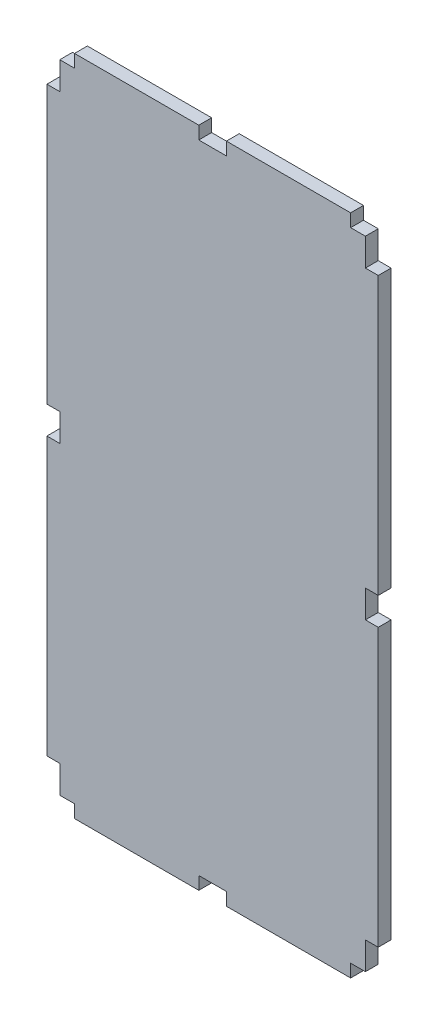
ISO-10303-21;
HEADER;
FILE_DESCRIPTION(('STEP AP214'),'2;1');
FILE_NAME('part.step','',(''),(''),'','','');
FILE_SCHEMA(('AUTOMOTIVE_DESIGN { 1 0 10303 214 1 1 1 1 }'));
ENDSEC;
DATA;
#1=APPLICATION_CONTEXT('core data for automotive mechanical design processes');
#2=APPLICATION_PROTOCOL_DEFINITION('international standard','automotive_design',2000,#1);
#3=PRODUCT_CONTEXT('',#1,'mechanical');
#4=PRODUCT('Part','Part','',(#3));
#5=PRODUCT_RELATED_PRODUCT_CATEGORY('part','',(#4));
#6=PRODUCT_DEFINITION_FORMATION('','',#4);
#7=PRODUCT_DEFINITION_CONTEXT('part definition',#1,'design');
#8=PRODUCT_DEFINITION('design','',#6,#7);
#9=PRODUCT_DEFINITION_SHAPE('','',#8);
#10=(LENGTH_UNIT() NAMED_UNIT(*) SI_UNIT(.MILLI.,.METRE.));
#11=(NAMED_UNIT(*) PLANE_ANGLE_UNIT() SI_UNIT($,.RADIAN.));
#12=(NAMED_UNIT(*) SI_UNIT($,.STERADIAN.) SOLID_ANGLE_UNIT());
#13=UNCERTAINTY_MEASURE_WITH_UNIT(LENGTH_MEASURE(1.E-05),#10,'distance_accuracy_value','');
#14=(GEOMETRIC_REPRESENTATION_CONTEXT(3) GLOBAL_UNCERTAINTY_ASSIGNED_CONTEXT((#13)) GLOBAL_UNIT_ASSIGNED_CONTEXT((#10,
#11,#12)) REPRESENTATION_CONTEXT('',''));
#15=CARTESIAN_POINT('',(0.,0.,0.));
#16=DIRECTION('',(0.,0.,1.));
#17=DIRECTION('',(1.,0.,0.));
#18=AXIS2_PLACEMENT_3D('',#15,#16,#17);
#19=CARTESIAN_POINT('',(0.,0.,11.81));
#20=DIRECTION('',(0.,0.,1.));
#21=DIRECTION('',(1.,0.,0.));
#22=AXIS2_PLACEMENT_3D('',#19,#20,#21);
#23=PLANE('',#22);
#24=DIRECTION('',(0.,1.,0.));
#25=VECTOR('',#24,1.);
#26=CARTESIAN_POINT('',(279.400000000005,457.199963665008,11.81));
#27=LINE('',#26,#25);
#28=CARTESIAN_POINT('',(279.400000000005,-115.190036334992,11.81));
#29=VERTEX_POINT('',#28);
#30=CARTESIAN_POINT('',(279.400000000005,139.699963665008,11.81));
#31=VERTEX_POINT('',#30);
#32=EDGE_CURVE('E518',#29,#31,#27,.T.);
#33=ORIENTED_EDGE('',*,*,#32,.T.);
#34=DIRECTION('',(-1.,0.,0.));
#35=VECTOR('',#34,1.);
#36=CARTESIAN_POINT('',(279.400000000005,139.699963665008,11.81));
#37=LINE('',#36,#35);
#38=CARTESIAN_POINT('',(267.590000000005,139.699963665008,11.81));
#39=VERTEX_POINT('',#38);
#40=EDGE_CURVE('E295',#31,#39,#37,.T.);
#41=ORIENTED_EDGE('',*,*,#40,.T.);
#42=DIRECTION('',(0.,1.,0.));
#43=VECTOR('',#42,1.);
#44=CARTESIAN_POINT('',(267.590000000005,139.699963665008,11.81));
#45=LINE('',#44,#43);
#46=CARTESIAN_POINT('',(267.590000000005,165.099963665008,11.81));
#47=VERTEX_POINT('',#46);
#48=EDGE_CURVE('E298',#39,#47,#45,.T.);
#49=ORIENTED_EDGE('',*,*,#48,.T.);
#50=DIRECTION('',(1.,0.,0.));
#51=VECTOR('',#50,1.);
#52=CARTESIAN_POINT('',(279.400000000005,165.099963665008,11.81));
#53=LINE('',#52,#51);
#54=CARTESIAN_POINT('',(279.400000000005,165.099963665008,11.81));
#55=VERTEX_POINT('',#54);
#56=EDGE_CURVE('E286',#47,#55,#53,.T.);
#57=ORIENTED_EDGE('',*,*,#56,.T.);
#58=CARTESIAN_POINT('',(279.400000000005,419.989963665008,11.81));
#59=VERTEX_POINT('',#58);
#60=EDGE_CURVE('E522',#55,#59,#27,.T.);
#61=ORIENTED_EDGE('',*,*,#60,.T.);
#62=DIRECTION('',(-1.,0.,0.));
#63=VECTOR('',#62,1.);
#64=CARTESIAN_POINT('',(279.400000000005,419.989963665008,11.81));
#65=LINE('',#64,#63);
#66=CARTESIAN_POINT('',(267.590000000005,419.989963665008,11.81));
#67=VERTEX_POINT('',#66);
#68=EDGE_CURVE('E313',#59,#67,#65,.T.);
#69=ORIENTED_EDGE('',*,*,#68,.T.);
#70=DIRECTION('',(0.,1.,0.));
#71=VECTOR('',#70,1.);
#72=CARTESIAN_POINT('',(267.590000000005,419.989963665008,11.81));
#73=LINE('',#72,#71);
#74=CARTESIAN_POINT('',(267.590000000005,445.389963665008,11.81));
#75=VERTEX_POINT('',#74);
#76=EDGE_CURVE('E316',#67,#75,#73,.T.);
#77=ORIENTED_EDGE('',*,*,#76,.T.);
#78=DIRECTION('',(-1.,0.,0.));
#79=VECTOR('',#78,1.);
#80=CARTESIAN_POINT('',(254.000000000005,445.389963665008,11.81));
#81=LINE('',#80,#79);
#82=CARTESIAN_POINT('',(254.000000000005,445.389963665008,11.81));
#83=VERTEX_POINT('',#82);
#84=EDGE_CURVE('E436',#75,#83,#81,.T.);
#85=ORIENTED_EDGE('',*,*,#84,.T.);
#86=DIRECTION('',(0.,1.,0.));
#87=VECTOR('',#86,1.);
#88=CARTESIAN_POINT('',(254.000000000005,457.199963665008,11.81));
#89=LINE('',#88,#87);
#90=CARTESIAN_POINT('',(254.000000000005,457.199963665008,11.81));
#91=VERTEX_POINT('',#90);
#92=EDGE_CURVE('E402',#83,#91,#89,.T.);
#93=ORIENTED_EDGE('',*,*,#92,.T.);
#94=DIRECTION('',(-1.,0.,0.));
#95=VECTOR('',#94,1.);
#96=CARTESIAN_POINT('',(-25.3999999999953,457.199963665008,11.81));
#97=LINE('',#96,#95);
#98=CARTESIAN_POINT('',(139.700000000005,457.199963665008,11.81));
#99=VERTEX_POINT('',#98);
#100=EDGE_CURVE('E524',#91,#99,#97,.T.);
#101=ORIENTED_EDGE('',*,*,#100,.T.);
#102=DIRECTION('',(0.,-1.,0.));
#103=VECTOR('',#102,1.);
#104=CARTESIAN_POINT('',(139.700000000005,457.199963665008,11.81));
#105=LINE('',#104,#103);
#106=CARTESIAN_POINT('',(139.700000000005,445.389963665008,11.81));
#107=VERTEX_POINT('',#106);
#108=EDGE_CURVE('E409',#99,#107,#105,.T.);
#109=ORIENTED_EDGE('',*,*,#108,.T.);
#110=DIRECTION('',(-1.,0.,0.));
#111=VECTOR('',#110,1.);
#112=CARTESIAN_POINT('',(114.300000000005,445.389963665008,11.81));
#113=LINE('',#112,#111);
#114=CARTESIAN_POINT('',(114.300000000005,445.389963665008,11.81));
#115=VERTEX_POINT('',#114);
#116=EDGE_CURVE('E418',#107,#115,#113,.T.);
#117=ORIENTED_EDGE('',*,*,#116,.T.);
#118=DIRECTION('',(0.,1.,0.));
#119=VECTOR('',#118,1.);
#120=CARTESIAN_POINT('',(114.300000000005,457.199963665008,11.81));
#121=LINE('',#120,#119);
#122=CARTESIAN_POINT('',(114.300000000005,457.199963665008,11.81));
#123=VERTEX_POINT('',#122);
#124=EDGE_CURVE('E415',#115,#123,#121,.T.);
#125=ORIENTED_EDGE('',*,*,#124,.T.);
#126=CARTESIAN_POINT('',(4.79130624064794E-12,457.199963665008,11.81));
#127=VERTEX_POINT('',#126);
#128=EDGE_CURVE('E521',#123,#127,#97,.T.);
#129=ORIENTED_EDGE('',*,*,#128,.T.);
#130=DIRECTION('',(0.,-1.,0.));
#131=VECTOR('',#130,1.);
#132=CARTESIAN_POINT('',(4.79130624064794E-12,457.199963665008,11.81));
#133=LINE('',#132,#131);
#134=CARTESIAN_POINT('',(4.78913677884325E-12,445.389963665008,11.81));
#135=VERTEX_POINT('',#134);
#136=EDGE_CURVE('E449',#127,#135,#133,.T.);
#137=ORIENTED_EDGE('',*,*,#136,.T.);
#138=DIRECTION('',(-1.,0.,0.));
#139=VECTOR('',#138,1.);
#140=CARTESIAN_POINT('',(-25.3999999999952,445.389963665008,11.81));
#141=LINE('',#140,#139);
#142=CARTESIAN_POINT('',(-13.5899999999952,445.389963665008,11.81));
#143=VERTEX_POINT('',#142);
#144=EDGE_CURVE('E426',#135,#143,#141,.T.);
#145=ORIENTED_EDGE('',*,*,#144,.T.);
#146=DIRECTION('',(0.,1.,0.));
#147=VECTOR('',#146,1.);
#148=CARTESIAN_POINT('',(-13.5899999999952,419.989963665008,11.81));
#149=LINE('',#148,#147);
#150=CARTESIAN_POINT('',(-13.5899999999952,419.989963665008,11.81));
#151=VERTEX_POINT('',#150);
#152=EDGE_CURVE('E375',#151,#143,#149,.T.);
#153=ORIENTED_EDGE('',*,*,#152,.F.);
#154=DIRECTION('',(1.,0.,0.));
#155=VECTOR('',#154,1.);
#156=CARTESIAN_POINT('',(-25.3999999999952,419.989963665008,11.81));
#157=LINE('',#156,#155);
#158=CARTESIAN_POINT('',(-25.3999999999952,419.989963665008,11.81));
#159=VERTEX_POINT('',#158);
#160=EDGE_CURVE('E339',#159,#151,#157,.T.);
#161=ORIENTED_EDGE('',*,*,#160,.F.);
#162=DIRECTION('',(0.,-1.,0.));
#163=VECTOR('',#162,1.);
#164=CARTESIAN_POINT('',(-25.3999999999953,457.199963665008,11.81));
#165=LINE('',#164,#163);
#166=CARTESIAN_POINT('',(-25.3999999999952,165.099963665008,11.81));
#167=VERTEX_POINT('',#166);
#168=EDGE_CURVE('E526',#159,#167,#165,.T.);
#169=ORIENTED_EDGE('',*,*,#168,.T.);
#170=DIRECTION('',(-1.,0.,0.));
#171=VECTOR('',#170,1.);
#172=CARTESIAN_POINT('',(-25.3999999999952,165.099963665008,11.81));
#173=LINE('',#172,#171);
#174=CARTESIAN_POINT('',(-13.5899999999952,165.099963665008,11.81));
#175=VERTEX_POINT('',#174);
#176=EDGE_CURVE('E347',#175,#167,#173,.T.);
#177=ORIENTED_EDGE('',*,*,#176,.F.);
#178=DIRECTION('',(0.,1.,0.));
#179=VECTOR('',#178,1.);
#180=CARTESIAN_POINT('',(-13.5899999999952,139.699963665008,11.81));
#181=LINE('',#180,#179);
#182=CARTESIAN_POINT('',(-13.5899999999952,139.699963665008,11.81));
#183=VERTEX_POINT('',#182);
#184=EDGE_CURVE('E357',#183,#175,#181,.T.);
#185=ORIENTED_EDGE('',*,*,#184,.F.);
#186=DIRECTION('',(1.,0.,0.));
#187=VECTOR('',#186,1.);
#188=CARTESIAN_POINT('',(-25.3999999999952,139.699963665008,11.81));
#189=LINE('',#188,#187);
#190=CARTESIAN_POINT('',(-25.3999999999952,139.699963665008,11.81));
#191=VERTEX_POINT('',#190);
#192=EDGE_CURVE('E354',#191,#183,#189,.T.);
#193=ORIENTED_EDGE('',*,*,#192,.F.);
#194=CARTESIAN_POINT('',(-25.3999999999952,-115.190036334992,11.81));
#195=VERTEX_POINT('',#194);
#196=EDGE_CURVE('E525',#191,#195,#165,.T.);
#197=ORIENTED_EDGE('',*,*,#196,.T.);
#198=DIRECTION('',(-1.,0.,0.));
#199=VECTOR('',#198,1.);
#200=CARTESIAN_POINT('',(-25.3999999999952,-115.190036334992,11.81));
#201=LINE('',#200,#199);
#202=CARTESIAN_POINT('',(-13.5899999999952,-115.190036334992,11.81));
#203=VERTEX_POINT('',#202);
#204=EDGE_CURVE('E391',#203,#195,#201,.T.);
#205=ORIENTED_EDGE('',*,*,#204,.F.);
#206=DIRECTION('',(0.,1.,0.));
#207=VECTOR('',#206,1.);
#208=CARTESIAN_POINT('',(-13.5899999999952,-140.590036334992,11.81));
#209=LINE('',#208,#207);
#210=CARTESIAN_POINT('',(-13.5899999999952,-140.590036334992,11.81));
#211=VERTEX_POINT('',#210);
#212=EDGE_CURVE('E365',#211,#203,#209,.T.);
#213=ORIENTED_EDGE('',*,*,#212,.F.);
#214=DIRECTION('',(-1.,0.,0.));
#215=VECTOR('',#214,1.);
#216=CARTESIAN_POINT('',(-25.3999999999952,-140.590036334992,11.81));
#217=LINE('',#216,#215);
#218=CARTESIAN_POINT('',(4.78913677884325E-12,-140.590036334992,11.81));
#219=VERTEX_POINT('',#218);
#220=EDGE_CURVE('E507',#219,#211,#217,.T.);
#221=ORIENTED_EDGE('',*,*,#220,.F.);
#222=DIRECTION('',(0.,1.,0.));
#223=VECTOR('',#222,1.);
#224=CARTESIAN_POINT('',(4.79130624064794E-12,-152.400036334992,11.81));
#225=LINE('',#224,#223);
#226=CARTESIAN_POINT('',(4.79130624064794E-12,-152.400036334992,11.81));
#227=VERTEX_POINT('',#226);
#228=EDGE_CURVE('E483',#227,#219,#225,.T.);
#229=ORIENTED_EDGE('',*,*,#228,.F.);
#230=DIRECTION('',(1.,0.,0.));
#231=VECTOR('',#230,1.);
#232=CARTESIAN_POINT('',(-25.3999999999952,-152.400036334992,11.81));
#233=LINE('',#232,#231);
#234=CARTESIAN_POINT('',(114.300000000005,-152.400036334992,11.81));
#235=VERTEX_POINT('',#234);
#236=EDGE_CURVE('E11',#227,#235,#233,.T.);
#237=ORIENTED_EDGE('',*,*,#236,.T.);
#238=DIRECTION('',(0.,-1.,0.));
#239=VECTOR('',#238,1.);
#240=CARTESIAN_POINT('',(114.300000000005,-152.400036334992,11.81));
#241=LINE('',#240,#239);
#242=CARTESIAN_POINT('',(114.300000000005,-140.590036334992,11.81));
#243=VERTEX_POINT('',#242);
#244=EDGE_CURVE('E473',#243,#235,#241,.T.);
#245=ORIENTED_EDGE('',*,*,#244,.F.);
#246=DIRECTION('',(-1.,0.,0.));
#247=VECTOR('',#246,1.);
#248=CARTESIAN_POINT('',(114.300000000005,-140.590036334992,11.81));
#249=LINE('',#248,#247);
#250=CARTESIAN_POINT('',(139.700000000005,-140.590036334992,11.81));
#251=VERTEX_POINT('',#250);
#252=EDGE_CURVE('E466',#251,#243,#249,.T.);
#253=ORIENTED_EDGE('',*,*,#252,.F.);
#254=DIRECTION('',(0.,1.,0.));
#255=VECTOR('',#254,1.);
#256=CARTESIAN_POINT('',(139.700000000005,-152.400036334992,11.81));
#257=LINE('',#256,#255);
#258=CARTESIAN_POINT('',(139.700000000005,-152.400036334992,11.81));
#259=VERTEX_POINT('',#258);
#260=EDGE_CURVE('E475',#259,#251,#257,.T.);
#261=ORIENTED_EDGE('',*,*,#260,.F.);
#262=CARTESIAN_POINT('',(254.000000000005,-152.400036334992,11.81));
#263=VERTEX_POINT('',#262);
#264=EDGE_CURVE('E46',#259,#263,#233,.T.);
#265=ORIENTED_EDGE('',*,*,#264,.T.);
#266=DIRECTION('',(0.,-1.,0.));
#267=VECTOR('',#266,1.);
#268=CARTESIAN_POINT('',(254.000000000005,-152.400036334992,11.81));
#269=LINE('',#268,#267);
#270=CARTESIAN_POINT('',(254.000000000005,-140.590036334992,11.81));
#271=VERTEX_POINT('',#270);
#272=EDGE_CURVE('E460',#271,#263,#269,.T.);
#273=ORIENTED_EDGE('',*,*,#272,.F.);
#274=DIRECTION('',(-1.,0.,0.));
#275=VECTOR('',#274,1.);
#276=CARTESIAN_POINT('',(254.000000000005,-140.590036334992,11.81));
#277=LINE('',#276,#275);
#278=CARTESIAN_POINT('',(267.590000000005,-140.590036334992,11.81));
#279=VERTEX_POINT('',#278);
#280=EDGE_CURVE('E494',#279,#271,#277,.T.);
#281=ORIENTED_EDGE('',*,*,#280,.F.);
#282=DIRECTION('',(0.,1.,0.));
#283=VECTOR('',#282,1.);
#284=CARTESIAN_POINT('',(267.590000000005,-140.590036334992,11.81));
#285=LINE('',#284,#283);
#286=CARTESIAN_POINT('',(267.590000000005,-115.190036334992,11.81));
#287=VERTEX_POINT('',#286);
#288=EDGE_CURVE('E329',#279,#287,#285,.T.);
#289=ORIENTED_EDGE('',*,*,#288,.T.);
#290=DIRECTION('',(1.,0.,0.));
#291=VECTOR('',#290,1.);
#292=CARTESIAN_POINT('',(279.400000000005,-115.190036334992,11.81));
#293=LINE('',#292,#291);
#294=EDGE_CURVE('E308',#287,#29,#293,.T.);
#295=ORIENTED_EDGE('',*,*,#294,.T.);
#296=EDGE_LOOP('',(#33,#41,#49,#57,#61,#69,#77,#85,#93,#101,#109,#117,#125,#129,#137,#145,#153,
#161,#169,#177,#185,#193,#197,#205,#213,#221,#229,#237,#245,#253,#261,#265,#273,#281,#289,#295));
#297=FACE_BOUND('',#296,.T.);
#298=ADVANCED_FACE('F37',(#297),#23,.T.);
#299=CARTESIAN_POINT('',(0.,0.,0.));
#300=DIRECTION('',(0.,0.,1.));
#301=DIRECTION('',(1.,0.,0.));
#302=AXIS2_PLACEMENT_3D('',#299,#300,#301);
#303=PLANE('',#302);
#304=DIRECTION('',(-1.,0.,0.));
#305=VECTOR('',#304,1.);
#306=CARTESIAN_POINT('',(279.400000000005,139.699963665008,0.));
#307=LINE('',#306,#305);
#308=CARTESIAN_POINT('',(279.400000000005,139.699963665008,0.));
#309=VERTEX_POINT('',#308);
#310=CARTESIAN_POINT('',(267.590000000005,139.699963665008,0.));
#311=VERTEX_POINT('',#310);
#312=EDGE_CURVE('E282',#309,#311,#307,.T.);
#313=ORIENTED_EDGE('',*,*,#312,.F.);
#314=DIRECTION('',(0.,1.,0.));
#315=VECTOR('',#314,1.);
#316=CARTESIAN_POINT('',(279.400000000005,457.199963665008,0.));
#317=LINE('',#316,#315);
#318=CARTESIAN_POINT('',(279.400000000005,-115.190036334992,0.));
#319=VERTEX_POINT('',#318);
#320=EDGE_CURVE('E528',#319,#309,#317,.T.);
#321=ORIENTED_EDGE('',*,*,#320,.F.);
#322=DIRECTION('',(1.,0.,0.));
#323=VECTOR('',#322,1.);
#324=CARTESIAN_POINT('',(279.400000000005,-115.190036334992,0.));
#325=LINE('',#324,#323);
#326=CARTESIAN_POINT('',(267.590000000005,-115.190036334992,0.));
#327=VERTEX_POINT('',#326);
#328=EDGE_CURVE('E326',#327,#319,#325,.T.);
#329=ORIENTED_EDGE('',*,*,#328,.F.);
#330=DIRECTION('',(0.,1.,0.));
#331=VECTOR('',#330,1.);
#332=CARTESIAN_POINT('',(267.590000000005,-140.590036334992,0.));
#333=LINE('',#332,#331);
#334=CARTESIAN_POINT('',(267.590000000005,-140.590036334992,0.));
#335=VERTEX_POINT('',#334);
#336=EDGE_CURVE('E328',#335,#327,#333,.T.);
#337=ORIENTED_EDGE('',*,*,#336,.F.);
#338=DIRECTION('',(-1.,0.,0.));
#339=VECTOR('',#338,1.);
#340=CARTESIAN_POINT('',(254.000000000005,-140.590036334992,0.));
#341=LINE('',#340,#339);
#342=CARTESIAN_POINT('',(254.000000000005,-140.590036334992,0.));
#343=VERTEX_POINT('',#342);
#344=EDGE_CURVE('E493',#335,#343,#341,.T.);
#345=ORIENTED_EDGE('',*,*,#344,.T.);
#346=DIRECTION('',(0.,-1.,0.));
#347=VECTOR('',#346,1.);
#348=CARTESIAN_POINT('',(254.000000000005,-152.400036334992,0.));
#349=LINE('',#348,#347);
#350=CARTESIAN_POINT('',(254.000000000005,-152.400036334992,0.));
#351=VERTEX_POINT('',#350);
#352=EDGE_CURVE('E490',#343,#351,#349,.T.);
#353=ORIENTED_EDGE('',*,*,#352,.T.);
#354=DIRECTION('',(1.,0.,0.));
#355=VECTOR('',#354,1.);
#356=CARTESIAN_POINT('',(-25.3999999999952,-152.400036334992,0.));
#357=LINE('',#356,#355);
#358=CARTESIAN_POINT('',(139.700000000005,-152.400036334992,0.));
#359=VERTEX_POINT('',#358);
#360=EDGE_CURVE('E540',#359,#351,#357,.T.);
#361=ORIENTED_EDGE('',*,*,#360,.F.);
#362=DIRECTION('',(0.,1.,0.));
#363=VECTOR('',#362,1.);
#364=CARTESIAN_POINT('',(139.700000000005,-152.400036334992,0.));
#365=LINE('',#364,#363);
#366=CARTESIAN_POINT('',(139.700000000005,-140.590036334992,0.));
#367=VERTEX_POINT('',#366);
#368=EDGE_CURVE('E465',#359,#367,#365,.T.);
#369=ORIENTED_EDGE('',*,*,#368,.T.);
#370=DIRECTION('',(-1.,0.,0.));
#371=VECTOR('',#370,1.);
#372=CARTESIAN_POINT('',(114.300000000005,-140.590036334992,0.));
#373=LINE('',#372,#371);
#374=CARTESIAN_POINT('',(114.300000000005,-140.590036334992,0.));
#375=VERTEX_POINT('',#374);
#376=EDGE_CURVE('E469',#367,#375,#373,.T.);
#377=ORIENTED_EDGE('',*,*,#376,.T.);
#378=DIRECTION('',(0.,-1.,0.));
#379=VECTOR('',#378,1.);
#380=CARTESIAN_POINT('',(114.300000000005,-152.400036334992,0.));
#381=LINE('',#380,#379);
#382=CARTESIAN_POINT('',(114.300000000005,-152.400036334992,0.));
#383=VERTEX_POINT('',#382);
#384=EDGE_CURVE('E462',#375,#383,#381,.T.);
#385=ORIENTED_EDGE('',*,*,#384,.T.);
#386=CARTESIAN_POINT('',(4.79130624064794E-12,-152.400036334992,0.));
#387=VERTEX_POINT('',#386);
#388=EDGE_CURVE('E41',#387,#383,#357,.T.);
#389=ORIENTED_EDGE('',*,*,#388,.F.);
#390=DIRECTION('',(0.,1.,0.));
#391=VECTOR('',#390,1.);
#392=CARTESIAN_POINT('',(4.79130624064794E-12,-152.400036334992,0.));
#393=LINE('',#392,#391);
#394=CARTESIAN_POINT('',(0.,-140.590036334992,0.));
#395=VERTEX_POINT('',#394);
#396=EDGE_CURVE('E503',#387,#395,#393,.T.);
#397=ORIENTED_EDGE('',*,*,#396,.T.);
#398=DIRECTION('',(-1.,0.,0.));
#399=VECTOR('',#398,1.);
#400=CARTESIAN_POINT('',(-25.3999999999952,-140.590036334992,0.));
#401=LINE('',#400,#399);
#402=CARTESIAN_POINT('',(-13.5899999999952,-140.590036334992,0.));
#403=VERTEX_POINT('',#402);
#404=EDGE_CURVE('E506',#395,#403,#401,.T.);
#405=ORIENTED_EDGE('',*,*,#404,.T.);
#406=DIRECTION('',(0.,1.,0.));
#407=VECTOR('',#406,1.);
#408=CARTESIAN_POINT('',(-13.5899999999952,-140.590036334992,0.));
#409=LINE('',#408,#407);
#410=CARTESIAN_POINT('',(-13.5899999999952,-115.190036334992,0.));
#411=VERTEX_POINT('',#410);
#412=EDGE_CURVE('E387',#403,#411,#409,.T.);
#413=ORIENTED_EDGE('',*,*,#412,.T.);
#414=DIRECTION('',(-1.,0.,0.));
#415=VECTOR('',#414,1.);
#416=CARTESIAN_POINT('',(-25.3999999999952,-115.190036334992,0.));
#417=LINE('',#416,#415);
#418=CARTESIAN_POINT('',(-25.3999999999952,-115.190036334992,0.));
#419=VERTEX_POINT('',#418);
#420=EDGE_CURVE('E390',#411,#419,#417,.T.);
#421=ORIENTED_EDGE('',*,*,#420,.T.);
#422=DIRECTION('',(0.,-1.,0.));
#423=VECTOR('',#422,1.);
#424=CARTESIAN_POINT('',(-25.3999999999953,457.199963665008,0.));
#425=LINE('',#424,#423);
#426=CARTESIAN_POINT('',(-25.3999999999952,139.699963665008,0.));
#427=VERTEX_POINT('',#426);
#428=EDGE_CURVE('E533',#427,#419,#425,.T.);
#429=ORIENTED_EDGE('',*,*,#428,.F.);
#430=DIRECTION('',(1.,0.,0.));
#431=VECTOR('',#430,1.);
#432=CARTESIAN_POINT('',(-25.3999999999952,139.699963665008,0.));
#433=LINE('',#432,#431);
#434=CARTESIAN_POINT('',(-13.5899999999952,139.699963665008,0.));
#435=VERTEX_POINT('',#434);
#436=EDGE_CURVE('E343',#427,#435,#433,.T.);
#437=ORIENTED_EDGE('',*,*,#436,.T.);
#438=DIRECTION('',(0.,1.,0.));
#439=VECTOR('',#438,1.);
#440=CARTESIAN_POINT('',(-13.5899999999952,139.699963665008,0.));
#441=LINE('',#440,#439);
#442=CARTESIAN_POINT('',(-13.5899999999952,165.099963665008,0.));
#443=VERTEX_POINT('',#442);
#444=EDGE_CURVE('E346',#435,#443,#441,.T.);
#445=ORIENTED_EDGE('',*,*,#444,.T.);
#446=DIRECTION('',(-1.,0.,0.));
#447=VECTOR('',#446,1.);
#448=CARTESIAN_POINT('',(-25.3999999999952,165.099963665008,0.));
#449=LINE('',#448,#447);
#450=CARTESIAN_POINT('',(-25.3999999999952,165.099963665008,0.));
#451=VERTEX_POINT('',#450);
#452=EDGE_CURVE('E350',#443,#451,#449,.T.);
#453=ORIENTED_EDGE('',*,*,#452,.T.);
#454=CARTESIAN_POINT('',(-25.3999999999952,419.989963665008,0.));
#455=VERTEX_POINT('',#454);
#456=EDGE_CURVE('E534',#455,#451,#425,.T.);
#457=ORIENTED_EDGE('',*,*,#456,.F.);
#458=DIRECTION('',(1.,0.,0.));
#459=VECTOR('',#458,1.);
#460=CARTESIAN_POINT('',(-25.3999999999952,419.989963665008,0.));
#461=LINE('',#460,#459);
#462=CARTESIAN_POINT('',(-13.5899999999952,419.989963665008,0.));
#463=VERTEX_POINT('',#462);
#464=EDGE_CURVE('E371',#455,#463,#461,.T.);
#465=ORIENTED_EDGE('',*,*,#464,.T.);
#466=DIRECTION('',(0.,1.,0.));
#467=VECTOR('',#466,1.);
#468=CARTESIAN_POINT('',(-13.5899999999952,419.989963665008,0.));
#469=LINE('',#468,#467);
#470=CARTESIAN_POINT('',(-13.5899999999952,445.389963665008,0.));
#471=VERTEX_POINT('',#470);
#472=EDGE_CURVE('E374',#463,#471,#469,.T.);
#473=ORIENTED_EDGE('',*,*,#472,.T.);
#474=DIRECTION('',(-1.,0.,0.));
#475=VECTOR('',#474,1.);
#476=CARTESIAN_POINT('',(-25.3999999999952,445.389963665008,0.));
#477=LINE('',#476,#475);
#478=CARTESIAN_POINT('',(4.78913677903328E-12,445.389963665008,0.));
#479=VERTEX_POINT('',#478);
#480=EDGE_CURVE('E445',#479,#471,#477,.T.);
#481=ORIENTED_EDGE('',*,*,#480,.F.);
#482=DIRECTION('',(0.,-1.,0.));
#483=VECTOR('',#482,1.);
#484=CARTESIAN_POINT('',(4.79130624064794E-12,457.199963665008,0.));
#485=LINE('',#484,#483);
#486=CARTESIAN_POINT('',(4.79130624064794E-12,457.199963665008,0.));
#487=VERTEX_POINT('',#486);
#488=EDGE_CURVE('E448',#487,#479,#485,.T.);
#489=ORIENTED_EDGE('',*,*,#488,.F.);
#490=DIRECTION('',(-1.,0.,0.));
#491=VECTOR('',#490,1.);
#492=CARTESIAN_POINT('',(-25.3999999999953,457.199963665008,0.));
#493=LINE('',#492,#491);
#494=CARTESIAN_POINT('',(114.300000000005,457.199963665008,0.));
#495=VERTEX_POINT('',#494);
#496=EDGE_CURVE('E531',#495,#487,#493,.T.);
#497=ORIENTED_EDGE('',*,*,#496,.F.);
#498=DIRECTION('',(0.,1.,0.));
#499=VECTOR('',#498,1.);
#500=CARTESIAN_POINT('',(114.300000000005,457.199963665008,0.));
#501=LINE('',#500,#499);
#502=CARTESIAN_POINT('',(114.300000000005,445.389963665008,0.));
#503=VERTEX_POINT('',#502);
#504=EDGE_CURVE('E406',#503,#495,#501,.T.);
#505=ORIENTED_EDGE('',*,*,#504,.F.);
#506=DIRECTION('',(-1.,0.,0.));
#507=VECTOR('',#506,1.);
#508=CARTESIAN_POINT('',(114.300000000005,445.389963665008,0.));
#509=LINE('',#508,#507);
#510=CARTESIAN_POINT('',(139.700000000005,445.389963665008,0.));
#511=VERTEX_POINT('',#510);
#512=EDGE_CURVE('E408',#511,#503,#509,.T.);
#513=ORIENTED_EDGE('',*,*,#512,.F.);
#514=DIRECTION('',(0.,-1.,0.));
#515=VECTOR('',#514,1.);
#516=CARTESIAN_POINT('',(139.700000000005,457.199963665008,0.));
#517=LINE('',#516,#515);
#518=CARTESIAN_POINT('',(139.700000000005,457.199963665008,0.));
#519=VERTEX_POINT('',#518);
#520=EDGE_CURVE('E411',#519,#511,#517,.T.);
#521=ORIENTED_EDGE('',*,*,#520,.F.);
#522=CARTESIAN_POINT('',(254.000000000005,457.199963665008,0.));
#523=VERTEX_POINT('',#522);
#524=EDGE_CURVE('E532',#523,#519,#493,.T.);
#525=ORIENTED_EDGE('',*,*,#524,.F.);
#526=DIRECTION('',(0.,1.,0.));
#527=VECTOR('',#526,1.);
#528=CARTESIAN_POINT('',(254.000000000005,457.199963665008,0.));
#529=LINE('',#528,#527);
#530=CARTESIAN_POINT('',(254.000000000005,445.389963665008,0.));
#531=VERTEX_POINT('',#530);
#532=EDGE_CURVE('E433',#531,#523,#529,.T.);
#533=ORIENTED_EDGE('',*,*,#532,.F.);
#534=DIRECTION('',(-1.,0.,0.));
#535=VECTOR('',#534,1.);
#536=CARTESIAN_POINT('',(254.000000000005,445.389963665008,0.));
#537=LINE('',#536,#535);
#538=CARTESIAN_POINT('',(267.590000000005,445.389963665008,0.));
#539=VERTEX_POINT('',#538);
#540=EDGE_CURVE('E435',#539,#531,#537,.T.);
#541=ORIENTED_EDGE('',*,*,#540,.F.);
#542=DIRECTION('',(0.,1.,0.));
#543=VECTOR('',#542,1.);
#544=CARTESIAN_POINT('',(267.590000000005,419.989963665008,0.));
#545=LINE('',#544,#543);
#546=CARTESIAN_POINT('',(267.590000000005,419.989963665008,0.));
#547=VERTEX_POINT('',#546);
#548=EDGE_CURVE('E62',#547,#539,#545,.T.);
#549=ORIENTED_EDGE('',*,*,#548,.F.);
#550=DIRECTION('',(-1.,0.,0.));
#551=VECTOR('',#550,1.);
#552=CARTESIAN_POINT('',(279.400000000005,419.989963665008,0.));
#553=LINE('',#552,#551);
#554=CARTESIAN_POINT('',(279.400000000005,419.989963665008,0.));
#555=VERTEX_POINT('',#554);
#556=EDGE_CURVE('E312',#555,#547,#553,.T.);
#557=ORIENTED_EDGE('',*,*,#556,.F.);
#558=CARTESIAN_POINT('',(279.400000000005,165.099963665009,0.));
#559=VERTEX_POINT('',#558);
#560=EDGE_CURVE('E294',#559,#555,#317,.T.);
#561=ORIENTED_EDGE('',*,*,#560,.F.);
#562=DIRECTION('',(1.,0.,0.));
#563=VECTOR('',#562,1.);
#564=CARTESIAN_POINT('',(279.400000000005,165.099963665008,0.));
#565=LINE('',#564,#563);
#566=CARTESIAN_POINT('',(267.590000000005,165.099963665008,0.));
#567=VERTEX_POINT('',#566);
#568=EDGE_CURVE('E54',#567,#559,#565,.T.);
#569=ORIENTED_EDGE('',*,*,#568,.F.);
#570=DIRECTION('',(0.,1.,0.));
#571=VECTOR('',#570,1.);
#572=CARTESIAN_POINT('',(267.590000000005,139.699963665008,0.));
#573=LINE('',#572,#571);
#574=EDGE_CURVE('E274',#311,#567,#573,.T.);
#575=ORIENTED_EDGE('',*,*,#574,.F.);
#576=EDGE_LOOP('',(#313,#321,#329,#337,#345,#353,#361,#369,#377,#385,#389,#397,#405,#413,#421,
#429,#437,#445,#453,#457,#465,#473,#481,#489,#497,#505,#513,#521,#525,#533,#541,#549,#557,#561,
#569,#575));
#577=FACE_BOUND('',#576,.T.);
#578=ADVANCED_FACE('F291',(#577),#303,.F.);
#579=CARTESIAN_POINT('',(279.400000000005,457.199963665008,11.81));
#580=DIRECTION('',(-1.,0.,0.));
#581=DIRECTION('',(0.,-1.,0.));
#582=AXIS2_PLACEMENT_3D('',#579,#580,#581);
#583=PLANE('',#582);
#584=DIRECTION('',(0.,0.,1.));
#585=VECTOR('',#584,1.);
#586=CARTESIAN_POINT('',(279.400000000005,139.699963665008,0.));
#587=LINE('',#586,#585);
#588=EDGE_CURVE('E305',#309,#31,#587,.T.);
#589=ORIENTED_EDGE('',*,*,#588,.T.);
#590=ORIENTED_EDGE('',*,*,#32,.F.);
#591=DIRECTION('',(0.,0.,1.));
#592=VECTOR('',#591,1.);
#593=CARTESIAN_POINT('',(279.400000000005,-115.190036334992,0.));
#594=LINE('',#593,#592);
#595=EDGE_CURVE('E331',#319,#29,#594,.T.);
#596=ORIENTED_EDGE('',*,*,#595,.F.);
#597=ORIENTED_EDGE('',*,*,#320,.T.);
#598=EDGE_LOOP('',(#589,#590,#596,#597));
#599=FACE_BOUND('',#598,.T.);
#600=ADVANCED_FACE('F39',(#599),#583,.F.);
#601=DIRECTION('',(0.,0.,1.));
#602=VECTOR('',#601,1.);
#603=CARTESIAN_POINT('',(279.400000000005,165.099963665008,0.));
#604=LINE('',#603,#602);
#605=EDGE_CURVE('E288',#559,#55,#604,.T.);
#606=ORIENTED_EDGE('',*,*,#605,.F.);
#607=ORIENTED_EDGE('',*,*,#560,.T.);
#608=DIRECTION('',(0.,0.,1.));
#609=VECTOR('',#608,1.);
#610=CARTESIAN_POINT('',(279.400000000005,419.989963665008,0.));
#611=LINE('',#610,#609);
#612=EDGE_CURVE('E303',#555,#59,#611,.T.);
#613=ORIENTED_EDGE('',*,*,#612,.T.);
#614=ORIENTED_EDGE('',*,*,#60,.F.);
#615=EDGE_LOOP('',(#606,#607,#613,#614));
#616=FACE_BOUND('',#615,.T.);
#617=ADVANCED_FACE('F566',(#616),#583,.F.);
#618=CARTESIAN_POINT('',(254.000000000005,445.389963665008,0.));
#619=DIRECTION('',(0.,1.,0.));
#620=DIRECTION('',(-1.,0.,0.));
#621=AXIS2_PLACEMENT_3D('',#618,#619,#620);
#622=PLANE('',#621);
#623=ORIENTED_EDGE('',*,*,#84,.F.);
#624=DIRECTION('',(0.,0.,1.));
#625=VECTOR('',#624,1.);
#626=CARTESIAN_POINT('',(267.590000000005,445.389963665008,0.));
#627=LINE('',#626,#625);
#628=EDGE_CURVE('E315',#539,#75,#627,.T.);
#629=ORIENTED_EDGE('',*,*,#628,.F.);
#630=ORIENTED_EDGE('',*,*,#540,.T.);
#631=DIRECTION('',(0.,0.,1.));
#632=VECTOR('',#631,1.);
#633=CARTESIAN_POINT('',(254.000000000005,445.389963665008,0.));
#634=LINE('',#633,#632);
#635=EDGE_CURVE('E438',#531,#83,#634,.T.);
#636=ORIENTED_EDGE('',*,*,#635,.T.);
#637=EDGE_LOOP('',(#623,#629,#630,#636));
#638=FACE_BOUND('',#637,.T.);
#639=ADVANCED_FACE('F563',(#638),#622,.T.);
#640=CARTESIAN_POINT('',(254.000000000005,-140.590036334992,0.));
#641=DIRECTION('',(0.,1.,0.));
#642=DIRECTION('',(-1.,0.,0.));
#643=AXIS2_PLACEMENT_3D('',#640,#641,#642);
#644=PLANE('',#643);
#645=DIRECTION('',(0.,0.,1.));
#646=VECTOR('',#645,1.);
#647=CARTESIAN_POINT('',(267.590000000005,-140.590036334992,0.));
#648=LINE('',#647,#646);
#649=EDGE_CURVE('E336',#335,#279,#648,.T.);
#650=ORIENTED_EDGE('',*,*,#649,.T.);
#651=ORIENTED_EDGE('',*,*,#280,.T.);
#652=DIRECTION('',(0.,0.,1.));
#653=VECTOR('',#652,1.);
#654=CARTESIAN_POINT('',(254.000000000005,-140.590036334992,0.));
#655=LINE('',#654,#653);
#656=EDGE_CURVE('E476',#343,#271,#655,.T.);
#657=ORIENTED_EDGE('',*,*,#656,.F.);
#658=ORIENTED_EDGE('',*,*,#344,.F.);
#659=EDGE_LOOP('',(#650,#651,#657,#658));
#660=FACE_BOUND('',#659,.T.);
#661=ADVANCED_FACE('F586',(#660),#644,.F.);
#662=CARTESIAN_POINT('',(-25.3999999999953,457.199963665008,11.81));
#663=DIRECTION('',(1.,0.,0.));
#664=DIRECTION('',(0.,1.,0.));
#665=AXIS2_PLACEMENT_3D('',#662,#663,#664);
#666=PLANE('',#665);
#667=ORIENTED_EDGE('',*,*,#456,.T.);
#668=DIRECTION('',(0.,0.,1.));
#669=VECTOR('',#668,1.);
#670=CARTESIAN_POINT('',(-25.3999999999952,165.099963665008,0.));
#671=LINE('',#670,#669);
#672=EDGE_CURVE('E362',#451,#167,#671,.T.);
#673=ORIENTED_EDGE('',*,*,#672,.T.);
#674=ORIENTED_EDGE('',*,*,#168,.F.);
#675=DIRECTION('',(0.,0.,1.));
#676=VECTOR('',#675,1.);
#677=CARTESIAN_POINT('',(-25.3999999999952,419.989963665008,0.));
#678=LINE('',#677,#676);
#679=EDGE_CURVE('E378',#455,#159,#678,.T.);
#680=ORIENTED_EDGE('',*,*,#679,.F.);
#681=EDGE_LOOP('',(#667,#673,#674,#680));
#682=FACE_BOUND('',#681,.T.);
#683=ADVANCED_FACE('F643',(#682),#666,.F.);
#684=CARTESIAN_POINT('',(-25.3999999999953,457.199963665008,11.81));
#685=DIRECTION('',(0.,-1.,0.));
#686=DIRECTION('',(0.,0.,-1.));
#687=AXIS2_PLACEMENT_3D('',#684,#685,#686);
#688=PLANE('',#687);
#689=DIRECTION('',(0.,0.,1.));
#690=VECTOR('',#689,1.);
#691=CARTESIAN_POINT('',(114.300000000005,457.199963665008,0.));
#692=LINE('',#691,#690);
#693=EDGE_CURVE('E424',#495,#123,#692,.T.);
#694=ORIENTED_EDGE('',*,*,#693,.F.);
#695=ORIENTED_EDGE('',*,*,#496,.T.);
#696=DIRECTION('',(0.,0.,1.));
#697=VECTOR('',#696,1.);
#698=CARTESIAN_POINT('',(4.79130624064794E-12,457.199963665008,0.));
#699=LINE('',#698,#697);
#700=EDGE_CURVE('E457',#487,#127,#699,.T.);
#701=ORIENTED_EDGE('',*,*,#700,.T.);
#702=ORIENTED_EDGE('',*,*,#128,.F.);
#703=EDGE_LOOP('',(#694,#695,#701,#702));
#704=FACE_BOUND('',#703,.T.);
#705=ADVANCED_FACE('F663',(#704),#688,.F.);
#706=DIRECTION('',(0.,0.,1.));
#707=VECTOR('',#706,1.);
#708=CARTESIAN_POINT('',(139.700000000005,457.199963665008,0.));
#709=LINE('',#708,#707);
#710=EDGE_CURVE('E427',#519,#99,#709,.T.);
#711=ORIENTED_EDGE('',*,*,#710,.T.);
#712=ORIENTED_EDGE('',*,*,#100,.F.);
#713=DIRECTION('',(0.,0.,1.));
#714=VECTOR('',#713,1.);
#715=CARTESIAN_POINT('',(254.000000000005,457.199963665008,0.));
#716=LINE('',#715,#714);
#717=EDGE_CURVE('E419',#523,#91,#716,.T.);
#718=ORIENTED_EDGE('',*,*,#717,.F.);
#719=ORIENTED_EDGE('',*,*,#524,.T.);
#720=EDGE_LOOP('',(#711,#712,#718,#719));
#721=FACE_BOUND('',#720,.T.);
#722=ADVANCED_FACE('F545',(#721),#688,.F.);
#723=ORIENTED_EDGE('',*,*,#196,.F.);
#724=DIRECTION('',(0.,0.,1.));
#725=VECTOR('',#724,1.);
#726=CARTESIAN_POINT('',(-25.3999999999952,139.699963665008,0.));
#727=LINE('',#726,#725);
#728=EDGE_CURVE('E353',#427,#191,#727,.T.);
#729=ORIENTED_EDGE('',*,*,#728,.F.);
#730=ORIENTED_EDGE('',*,*,#428,.T.);
#731=DIRECTION('',(0.,0.,1.));
#732=VECTOR('',#731,1.);
#733=CARTESIAN_POINT('',(-25.3999999999952,-115.190036334992,0.));
#734=LINE('',#733,#732);
#735=EDGE_CURVE('E399',#419,#195,#734,.T.);
#736=ORIENTED_EDGE('',*,*,#735,.T.);
#737=EDGE_LOOP('',(#723,#729,#730,#736));
#738=FACE_BOUND('',#737,.T.);
#739=ADVANCED_FACE('F627',(#738),#666,.F.);
#740=CARTESIAN_POINT('',(-25.3999999999952,-152.400036334992,11.81));
#741=DIRECTION('',(0.,1.,0.));
#742=DIRECTION('',(0.,0.,1.));
#743=AXIS2_PLACEMENT_3D('',#740,#741,#742);
#744=PLANE('',#743);
#745=ORIENTED_EDGE('',*,*,#388,.T.);
#746=DIRECTION('',(0.,0.,1.));
#747=VECTOR('',#746,1.);
#748=CARTESIAN_POINT('',(114.300000000005,-152.400036334992,0.));
#749=LINE('',#748,#747);
#750=EDGE_CURVE('E472',#383,#235,#749,.T.);
#751=ORIENTED_EDGE('',*,*,#750,.T.);
#752=ORIENTED_EDGE('',*,*,#236,.F.);
#753=DIRECTION('',(0.,0.,1.));
#754=VECTOR('',#753,1.);
#755=CARTESIAN_POINT('',(4.79130624064794E-12,-152.400036334992,0.));
#756=LINE('',#755,#754);
#757=EDGE_CURVE('E510',#387,#227,#756,.T.);
#758=ORIENTED_EDGE('',*,*,#757,.F.);
#759=EDGE_LOOP('',(#745,#751,#752,#758));
#760=FACE_BOUND('',#759,.T.);
#761=ADVANCED_FACE('F604',(#760),#744,.F.);
#762=ORIENTED_EDGE('',*,*,#264,.F.);
#763=DIRECTION('',(0.,0.,1.));
#764=VECTOR('',#763,1.);
#765=CARTESIAN_POINT('',(139.700000000005,-152.400036334992,0.));
#766=LINE('',#765,#764);
#767=EDGE_CURVE('E486',#359,#259,#766,.T.);
#768=ORIENTED_EDGE('',*,*,#767,.F.);
#769=ORIENTED_EDGE('',*,*,#360,.T.);
#770=DIRECTION('',(0.,0.,1.));
#771=VECTOR('',#770,1.);
#772=CARTESIAN_POINT('',(254.000000000005,-152.400036334992,0.));
#773=LINE('',#772,#771);
#774=EDGE_CURVE('E496',#351,#263,#773,.T.);
#775=ORIENTED_EDGE('',*,*,#774,.T.);
#776=EDGE_LOOP('',(#762,#768,#769,#775));
#777=FACE_BOUND('',#776,.T.);
#778=ADVANCED_FACE('F597',(#777),#744,.F.);
#779=CARTESIAN_POINT('',(-25.3999999999952,-140.590036334992,0.));
#780=DIRECTION('',(0.,1.,0.));
#781=DIRECTION('',(-1.,0.,0.));
#782=AXIS2_PLACEMENT_3D('',#779,#780,#781);
#783=PLANE('',#782);
#784=ORIENTED_EDGE('',*,*,#220,.T.);
#785=DIRECTION('',(0.,0.,1.));
#786=VECTOR('',#785,1.);
#787=CARTESIAN_POINT('',(-13.5899999999952,-140.590036334992,0.));
#788=LINE('',#787,#786);
#789=EDGE_CURVE('E394',#403,#211,#788,.T.);
#790=ORIENTED_EDGE('',*,*,#789,.F.);
#791=ORIENTED_EDGE('',*,*,#404,.F.);
#792=DIRECTION('',(0.,0.,1.));
#793=VECTOR('',#792,1.);
#794=CARTESIAN_POINT('',(4.78913677884325E-12,-140.590036334992,0.));
#795=LINE('',#794,#793);
#796=EDGE_CURVE('E515',#395,#219,#795,.T.);
#797=ORIENTED_EDGE('',*,*,#796,.T.);
#798=EDGE_LOOP('',(#784,#790,#791,#797));
#799=FACE_BOUND('',#798,.T.);
#800=ADVANCED_FACE('F618',(#799),#783,.F.);
#801=CARTESIAN_POINT('',(4.79130624064794E-12,-152.400036334992,0.));
#802=DIRECTION('',(1.,0.,0.));
#803=DIRECTION('',(0.,1.,0.));
#804=AXIS2_PLACEMENT_3D('',#801,#802,#803);
#805=PLANE('',#804);
#806=ORIENTED_EDGE('',*,*,#228,.T.);
#807=ORIENTED_EDGE('',*,*,#796,.F.);
#808=ORIENTED_EDGE('',*,*,#396,.F.);
#809=ORIENTED_EDGE('',*,*,#757,.T.);
#810=EDGE_LOOP('',(#806,#807,#808,#809));
#811=FACE_BOUND('',#810,.T.);
#812=ADVANCED_FACE('F616',(#811),#805,.F.);
#813=CARTESIAN_POINT('',(254.000000000005,-152.400036334992,0.));
#814=DIRECTION('',(-1.,0.,0.));
#815=DIRECTION('',(0.,-1.,0.));
#816=AXIS2_PLACEMENT_3D('',#813,#814,#815);
#817=PLANE('',#816);
#818=ORIENTED_EDGE('',*,*,#272,.T.);
#819=ORIENTED_EDGE('',*,*,#774,.F.);
#820=ORIENTED_EDGE('',*,*,#352,.F.);
#821=ORIENTED_EDGE('',*,*,#656,.T.);
#822=EDGE_LOOP('',(#818,#819,#820,#821));
#823=FACE_BOUND('',#822,.T.);
#824=ADVANCED_FACE('F593',(#823),#817,.F.);
#825=CARTESIAN_POINT('',(114.300000000005,-152.400036334992,0.));
#826=DIRECTION('',(-1.,0.,0.));
#827=DIRECTION('',(0.,-1.,0.));
#828=AXIS2_PLACEMENT_3D('',#825,#826,#827);
#829=PLANE('',#828);
#830=ORIENTED_EDGE('',*,*,#244,.T.);
#831=ORIENTED_EDGE('',*,*,#750,.F.);
#832=ORIENTED_EDGE('',*,*,#384,.F.);
#833=DIRECTION('',(0.,0.,1.));
#834=VECTOR('',#833,1.);
#835=CARTESIAN_POINT('',(114.300000000005,-140.590036334992,0.));
#836=LINE('',#835,#834);
#837=EDGE_CURVE('E481',#375,#243,#836,.T.);
#838=ORIENTED_EDGE('',*,*,#837,.T.);
#839=EDGE_LOOP('',(#830,#831,#832,#838));
#840=FACE_BOUND('',#839,.T.);
#841=ADVANCED_FACE('F608',(#840),#829,.F.);
#842=CARTESIAN_POINT('',(114.300000000005,-140.590036334992,0.));
#843=DIRECTION('',(0.,1.,0.));
#844=DIRECTION('',(-1.,0.,0.));
#845=AXIS2_PLACEMENT_3D('',#842,#843,#844);
#846=PLANE('',#845);
#847=ORIENTED_EDGE('',*,*,#252,.T.);
#848=ORIENTED_EDGE('',*,*,#837,.F.);
#849=ORIENTED_EDGE('',*,*,#376,.F.);
#850=DIRECTION('',(0.,0.,1.));
#851=VECTOR('',#850,1.);
#852=CARTESIAN_POINT('',(139.700000000005,-140.590036334992,0.));
#853=LINE('',#852,#851);
#854=EDGE_CURVE('E484',#367,#251,#853,.T.);
#855=ORIENTED_EDGE('',*,*,#854,.T.);
#856=EDGE_LOOP('',(#847,#848,#849,#855));
#857=FACE_BOUND('',#856,.T.);
#858=ADVANCED_FACE('F727',(#857),#846,.F.);
#859=CARTESIAN_POINT('',(139.700000000005,-152.400036334992,0.));
#860=DIRECTION('',(1.,0.,0.));
#861=DIRECTION('',(0.,1.,0.));
#862=AXIS2_PLACEMENT_3D('',#859,#860,#861);
#863=PLANE('',#862);
#864=ORIENTED_EDGE('',*,*,#260,.T.);
#865=ORIENTED_EDGE('',*,*,#854,.F.);
#866=ORIENTED_EDGE('',*,*,#368,.F.);
#867=ORIENTED_EDGE('',*,*,#767,.T.);
#868=EDGE_LOOP('',(#864,#865,#866,#867));
#869=FACE_BOUND('',#868,.T.);
#870=ADVANCED_FACE('F733',(#869),#863,.F.);
#871=CARTESIAN_POINT('',(4.79130624064794E-12,457.199963665008,0.));
#872=DIRECTION('',(-1.,0.,0.));
#873=DIRECTION('',(0.,-1.,0.));
#874=AXIS2_PLACEMENT_3D('',#871,#872,#873);
#875=PLANE('',#874);
#876=ORIENTED_EDGE('',*,*,#136,.F.);
#877=ORIENTED_EDGE('',*,*,#700,.F.);
#878=ORIENTED_EDGE('',*,*,#488,.T.);
#879=DIRECTION('',(0.,0.,1.));
#880=VECTOR('',#879,1.);
#881=CARTESIAN_POINT('',(4.78913677884325E-12,445.389963665008,0.));
#882=LINE('',#881,#880);
#883=EDGE_CURVE('E452',#479,#135,#882,.T.);
#884=ORIENTED_EDGE('',*,*,#883,.T.);
#885=EDGE_LOOP('',(#876,#877,#878,#884));
#886=FACE_BOUND('',#885,.T.);
#887=ADVANCED_FACE('F659',(#886),#875,.T.);
#888=CARTESIAN_POINT('',(-25.3999999999952,445.389963665008,0.));
#889=DIRECTION('',(0.,1.,0.));
#890=DIRECTION('',(-1.,0.,0.));
#891=AXIS2_PLACEMENT_3D('',#888,#889,#890);
#892=PLANE('',#891);
#893=DIRECTION('',(0.,0.,1.));
#894=VECTOR('',#893,1.);
#895=CARTESIAN_POINT('',(-13.5899999999952,445.389963665008,0.));
#896=LINE('',#895,#894);
#897=EDGE_CURVE('E358',#471,#143,#896,.T.);
#898=ORIENTED_EDGE('',*,*,#897,.T.);
#899=ORIENTED_EDGE('',*,*,#144,.F.);
#900=ORIENTED_EDGE('',*,*,#883,.F.);
#901=ORIENTED_EDGE('',*,*,#480,.T.);
#902=EDGE_LOOP('',(#898,#899,#900,#901));
#903=FACE_BOUND('',#902,.T.);
#904=ADVANCED_FACE('F654',(#903),#892,.T.);
#905=CARTESIAN_POINT('',(254.000000000005,457.199963665008,0.));
#906=DIRECTION('',(1.,0.,0.));
#907=DIRECTION('',(0.,1.,0.));
#908=AXIS2_PLACEMENT_3D('',#905,#906,#907);
#909=PLANE('',#908);
#910=ORIENTED_EDGE('',*,*,#92,.F.);
#911=ORIENTED_EDGE('',*,*,#635,.F.);
#912=ORIENTED_EDGE('',*,*,#532,.T.);
#913=ORIENTED_EDGE('',*,*,#717,.T.);
#914=EDGE_LOOP('',(#910,#911,#912,#913));
#915=FACE_BOUND('',#914,.T.);
#916=ADVANCED_FACE('F561',(#915),#909,.T.);
#917=CARTESIAN_POINT('',(114.300000000005,457.199963665008,0.));
#918=DIRECTION('',(1.,0.,0.));
#919=DIRECTION('',(0.,1.,0.));
#920=AXIS2_PLACEMENT_3D('',#917,#918,#919);
#921=PLANE('',#920);
#922=ORIENTED_EDGE('',*,*,#124,.F.);
#923=DIRECTION('',(0.,0.,1.));
#924=VECTOR('',#923,1.);
#925=CARTESIAN_POINT('',(114.300000000005,445.389963665008,0.));
#926=LINE('',#925,#924);
#927=EDGE_CURVE('E414',#503,#115,#926,.T.);
#928=ORIENTED_EDGE('',*,*,#927,.F.);
#929=ORIENTED_EDGE('',*,*,#504,.T.);
#930=ORIENTED_EDGE('',*,*,#693,.T.);
#931=EDGE_LOOP('',(#922,#928,#929,#930));
#932=FACE_BOUND('',#931,.T.);
#933=ADVANCED_FACE('F667',(#932),#921,.T.);
#934=CARTESIAN_POINT('',(139.700000000005,457.199963665008,0.));
#935=DIRECTION('',(-1.,0.,0.));
#936=DIRECTION('',(0.,-1.,0.));
#937=AXIS2_PLACEMENT_3D('',#934,#935,#936);
#938=PLANE('',#937);
#939=ORIENTED_EDGE('',*,*,#108,.F.);
#940=ORIENTED_EDGE('',*,*,#710,.F.);
#941=ORIENTED_EDGE('',*,*,#520,.T.);
#942=DIRECTION('',(0.,0.,1.));
#943=VECTOR('',#942,1.);
#944=CARTESIAN_POINT('',(139.700000000005,445.389963665008,0.));
#945=LINE('',#944,#943);
#946=EDGE_CURVE('E430',#511,#107,#945,.T.);
#947=ORIENTED_EDGE('',*,*,#946,.T.);
#948=EDGE_LOOP('',(#939,#940,#941,#947));
#949=FACE_BOUND('',#948,.T.);
#950=ADVANCED_FACE('F554',(#949),#938,.T.);
#951=CARTESIAN_POINT('',(114.300000000005,445.389963665008,0.));
#952=DIRECTION('',(0.,1.,0.));
#953=DIRECTION('',(-1.,0.,0.));
#954=AXIS2_PLACEMENT_3D('',#951,#952,#953);
#955=PLANE('',#954);
#956=ORIENTED_EDGE('',*,*,#116,.F.);
#957=ORIENTED_EDGE('',*,*,#946,.F.);
#958=ORIENTED_EDGE('',*,*,#512,.T.);
#959=ORIENTED_EDGE('',*,*,#927,.T.);
#960=EDGE_LOOP('',(#956,#957,#958,#959));
#961=FACE_BOUND('',#960,.T.);
#962=ADVANCED_FACE('F670',(#961),#955,.T.);
#963=CARTESIAN_POINT('',(-25.3999999999952,-115.190036334992,0.));
#964=DIRECTION('',(0.,1.,0.));
#965=DIRECTION('',(0.,0.,1.));
#966=AXIS2_PLACEMENT_3D('',#963,#964,#965);
#967=PLANE('',#966);
#968=ORIENTED_EDGE('',*,*,#204,.T.);
#969=ORIENTED_EDGE('',*,*,#735,.F.);
#970=ORIENTED_EDGE('',*,*,#420,.F.);
#971=DIRECTION('',(0.,0.,1.));
#972=VECTOR('',#971,1.);
#973=CARTESIAN_POINT('',(-13.5899999999952,-115.190036334992,0.));
#974=LINE('',#973,#972);
#975=EDGE_CURVE('E403',#411,#203,#974,.T.);
#976=ORIENTED_EDGE('',*,*,#975,.T.);
#977=EDGE_LOOP('',(#968,#969,#970,#976));
#978=FACE_BOUND('',#977,.T.);
#979=ADVANCED_FACE('F625',(#978),#967,.F.);
#980=CARTESIAN_POINT('',(-13.5899999999952,-140.590036334992,0.));
#981=DIRECTION('',(1.,0.,0.));
#982=DIRECTION('',(0.,0.,-1.));
#983=AXIS2_PLACEMENT_3D('',#980,#981,#982);
#984=PLANE('',#983);
#985=ORIENTED_EDGE('',*,*,#212,.T.);
#986=ORIENTED_EDGE('',*,*,#975,.F.);
#987=ORIENTED_EDGE('',*,*,#412,.F.);
#988=ORIENTED_EDGE('',*,*,#789,.T.);
#989=EDGE_LOOP('',(#985,#986,#987,#988));
#990=FACE_BOUND('',#989,.T.);
#991=ADVANCED_FACE('F622',(#990),#984,.F.);
#992=CARTESIAN_POINT('',(-13.5899999999952,419.989963665008,0.));
#993=DIRECTION('',(1.,0.,0.));
#994=DIRECTION('',(0.,0.,-1.));
#995=AXIS2_PLACEMENT_3D('',#992,#993,#994);
#996=PLANE('',#995);
#997=ORIENTED_EDGE('',*,*,#152,.T.);
#998=ORIENTED_EDGE('',*,*,#897,.F.);
#999=ORIENTED_EDGE('',*,*,#472,.F.);
#1000=DIRECTION('',(0.,0.,1.));
#1001=VECTOR('',#1000,1.);
#1002=CARTESIAN_POINT('',(-13.5899999999952,419.989963665008,0.));
#1003=LINE('',#1002,#1001);
#1004=EDGE_CURVE('E384',#463,#151,#1003,.T.);
#1005=ORIENTED_EDGE('',*,*,#1004,.T.);
#1006=EDGE_LOOP('',(#997,#998,#999,#1005));
#1007=FACE_BOUND('',#1006,.T.);
#1008=ADVANCED_FACE('F794',(#1007),#996,.F.);
#1009=CARTESIAN_POINT('',(-25.3999999999952,419.989963665008,0.));
#1010=DIRECTION('',(0.,-1.,0.));
#1011=DIRECTION('',(0.,0.,-1.));
#1012=AXIS2_PLACEMENT_3D('',#1009,#1010,#1011);
#1013=PLANE('',#1012);
#1014=ORIENTED_EDGE('',*,*,#160,.T.);
#1015=ORIENTED_EDGE('',*,*,#1004,.F.);
#1016=ORIENTED_EDGE('',*,*,#464,.F.);
#1017=ORIENTED_EDGE('',*,*,#679,.T.);
#1018=EDGE_LOOP('',(#1014,#1015,#1016,#1017));
#1019=FACE_BOUND('',#1018,.T.);
#1020=ADVANCED_FACE('F648',(#1019),#1013,.F.);
#1021=CARTESIAN_POINT('',(-25.3999999999952,165.099963665008,0.));
#1022=DIRECTION('',(0.,1.,0.));
#1023=DIRECTION('',(0.,0.,1.));
#1024=AXIS2_PLACEMENT_3D('',#1021,#1022,#1023);
#1025=PLANE('',#1024);
#1026=ORIENTED_EDGE('',*,*,#176,.T.);
#1027=ORIENTED_EDGE('',*,*,#672,.F.);
#1028=ORIENTED_EDGE('',*,*,#452,.F.);
#1029=DIRECTION('',(0.,0.,1.));
#1030=VECTOR('',#1029,1.);
#1031=CARTESIAN_POINT('',(-13.5899999999952,165.099963665008,0.));
#1032=LINE('',#1031,#1030);
#1033=EDGE_CURVE('E366',#443,#175,#1032,.T.);
#1034=ORIENTED_EDGE('',*,*,#1033,.T.);
#1035=EDGE_LOOP('',(#1026,#1027,#1028,#1034));
#1036=FACE_BOUND('',#1035,.T.);
#1037=ADVANCED_FACE('F639',(#1036),#1025,.F.);
#1038=CARTESIAN_POINT('',(-13.5899999999952,139.699963665008,0.));
#1039=DIRECTION('',(1.,0.,0.));
#1040=DIRECTION('',(0.,0.,-1.));
#1041=AXIS2_PLACEMENT_3D('',#1038,#1039,#1040);
#1042=PLANE('',#1041);
#1043=ORIENTED_EDGE('',*,*,#184,.T.);
#1044=ORIENTED_EDGE('',*,*,#1033,.F.);
#1045=ORIENTED_EDGE('',*,*,#444,.F.);
#1046=DIRECTION('',(0.,0.,1.));
#1047=VECTOR('',#1046,1.);
#1048=CARTESIAN_POINT('',(-13.5899999999952,139.699963665008,0.));
#1049=LINE('',#1048,#1047);
#1050=EDGE_CURVE('E368',#435,#183,#1049,.T.);
#1051=ORIENTED_EDGE('',*,*,#1050,.T.);
#1052=EDGE_LOOP('',(#1043,#1044,#1045,#1051));
#1053=FACE_BOUND('',#1052,.T.);
#1054=ADVANCED_FACE('F637',(#1053),#1042,.F.);
#1055=CARTESIAN_POINT('',(-25.3999999999952,139.699963665008,0.));
#1056=DIRECTION('',(0.,-1.,0.));
#1057=DIRECTION('',(0.,0.,-1.));
#1058=AXIS2_PLACEMENT_3D('',#1055,#1056,#1057);
#1059=PLANE('',#1058);
#1060=ORIENTED_EDGE('',*,*,#192,.T.);
#1061=ORIENTED_EDGE('',*,*,#1050,.F.);
#1062=ORIENTED_EDGE('',*,*,#436,.F.);
#1063=ORIENTED_EDGE('',*,*,#728,.T.);
#1064=EDGE_LOOP('',(#1060,#1061,#1062,#1063));
#1065=FACE_BOUND('',#1064,.T.);
#1066=ADVANCED_FACE('F632',(#1065),#1059,.F.);
#1067=CARTESIAN_POINT('',(267.590000000005,-140.590036334992,0.));
#1068=DIRECTION('',(1.,0.,0.));
#1069=DIRECTION('',(0.,0.,-1.));
#1070=AXIS2_PLACEMENT_3D('',#1067,#1068,#1069);
#1071=PLANE('',#1070);
#1072=ORIENTED_EDGE('',*,*,#288,.F.);
#1073=ORIENTED_EDGE('',*,*,#649,.F.);
#1074=ORIENTED_EDGE('',*,*,#336,.T.);
#1075=DIRECTION('',(0.,0.,1.));
#1076=VECTOR('',#1075,1.);
#1077=CARTESIAN_POINT('',(267.590000000005,-115.190036334992,0.));
#1078=LINE('',#1077,#1076);
#1079=EDGE_CURVE('E340',#327,#287,#1078,.T.);
#1080=ORIENTED_EDGE('',*,*,#1079,.T.);
#1081=EDGE_LOOP('',(#1072,#1073,#1074,#1080));
#1082=FACE_BOUND('',#1081,.T.);
#1083=ADVANCED_FACE('F583',(#1082),#1071,.T.);
#1084=CARTESIAN_POINT('',(279.400000000005,-115.190036334992,0.));
#1085=DIRECTION('',(0.,-1.,0.));
#1086=DIRECTION('',(0.,0.,-1.));
#1087=AXIS2_PLACEMENT_3D('',#1084,#1085,#1086);
#1088=PLANE('',#1087);
#1089=ORIENTED_EDGE('',*,*,#294,.F.);
#1090=ORIENTED_EDGE('',*,*,#1079,.F.);
#1091=ORIENTED_EDGE('',*,*,#328,.T.);
#1092=ORIENTED_EDGE('',*,*,#595,.T.);
#1093=EDGE_LOOP('',(#1089,#1090,#1091,#1092));
#1094=FACE_BOUND('',#1093,.T.);
#1095=ADVANCED_FACE('F581',(#1094),#1088,.T.);
#1096=CARTESIAN_POINT('',(279.400000000005,419.989963665008,0.));
#1097=DIRECTION('',(0.,1.,0.));
#1098=DIRECTION('',(0.,0.,1.));
#1099=AXIS2_PLACEMENT_3D('',#1096,#1097,#1098);
#1100=PLANE('',#1099);
#1101=ORIENTED_EDGE('',*,*,#68,.F.);
#1102=ORIENTED_EDGE('',*,*,#612,.F.);
#1103=ORIENTED_EDGE('',*,*,#556,.T.);
#1104=DIRECTION('',(0.,0.,1.));
#1105=VECTOR('',#1104,1.);
#1106=CARTESIAN_POINT('',(267.590000000005,419.989963665008,0.));
#1107=LINE('',#1106,#1105);
#1108=EDGE_CURVE('E323',#547,#67,#1107,.T.);
#1109=ORIENTED_EDGE('',*,*,#1108,.T.);
#1110=EDGE_LOOP('',(#1101,#1102,#1103,#1109));
#1111=FACE_BOUND('',#1110,.T.);
#1112=ADVANCED_FACE('F897',(#1111),#1100,.T.);
#1113=CARTESIAN_POINT('',(267.590000000005,419.989963665008,0.));
#1114=DIRECTION('',(1.,0.,0.));
#1115=DIRECTION('',(0.,0.,-1.));
#1116=AXIS2_PLACEMENT_3D('',#1113,#1114,#1115);
#1117=PLANE('',#1116);
#1118=ORIENTED_EDGE('',*,*,#76,.F.);
#1119=ORIENTED_EDGE('',*,*,#1108,.F.);
#1120=ORIENTED_EDGE('',*,*,#548,.T.);
#1121=ORIENTED_EDGE('',*,*,#628,.T.);
#1122=EDGE_LOOP('',(#1118,#1119,#1120,#1121));
#1123=FACE_BOUND('',#1122,.T.);
#1124=ADVANCED_FACE('F931',(#1123),#1117,.T.);
#1125=CARTESIAN_POINT('',(279.400000000005,139.699963665008,0.));
#1126=DIRECTION('',(0.,1.,0.));
#1127=DIRECTION('',(0.,0.,1.));
#1128=AXIS2_PLACEMENT_3D('',#1125,#1126,#1127);
#1129=PLANE('',#1128);
#1130=ORIENTED_EDGE('',*,*,#40,.F.);
#1131=ORIENTED_EDGE('',*,*,#588,.F.);
#1132=ORIENTED_EDGE('',*,*,#312,.T.);
#1133=DIRECTION('',(0.,0.,1.));
#1134=VECTOR('',#1133,1.);
#1135=CARTESIAN_POINT('',(267.590000000005,139.699963665008,0.));
#1136=LINE('',#1135,#1134);
#1137=EDGE_CURVE('E279',#311,#39,#1136,.T.);
#1138=ORIENTED_EDGE('',*,*,#1137,.T.);
#1139=EDGE_LOOP('',(#1130,#1131,#1132,#1138));
#1140=FACE_BOUND('',#1139,.T.);
#1141=ADVANCED_FACE('F571',(#1140),#1129,.T.);
#1142=CARTESIAN_POINT('',(267.590000000005,139.699963665008,0.));
#1143=DIRECTION('',(1.,0.,0.));
#1144=DIRECTION('',(0.,0.,-1.));
#1145=AXIS2_PLACEMENT_3D('',#1142,#1143,#1144);
#1146=PLANE('',#1145);
#1147=ORIENTED_EDGE('',*,*,#48,.F.);
#1148=ORIENTED_EDGE('',*,*,#1137,.F.);
#1149=ORIENTED_EDGE('',*,*,#574,.T.);
#1150=DIRECTION('',(0.,0.,1.));
#1151=VECTOR('',#1150,1.);
#1152=CARTESIAN_POINT('',(267.590000000005,165.099963665008,0.));
#1153=LINE('',#1152,#1151);
#1154=EDGE_CURVE('E277',#567,#47,#1153,.T.);
#1155=ORIENTED_EDGE('',*,*,#1154,.T.);
#1156=EDGE_LOOP('',(#1147,#1148,#1149,#1155));
#1157=FACE_BOUND('',#1156,.T.);
#1158=ADVANCED_FACE('F276',(#1157),#1146,.T.);
#1159=CARTESIAN_POINT('',(279.400000000005,165.099963665008,0.));
#1160=DIRECTION('',(0.,-1.,0.));
#1161=DIRECTION('',(0.,0.,-1.));
#1162=AXIS2_PLACEMENT_3D('',#1159,#1160,#1161);
#1163=PLANE('',#1162);
#1164=ORIENTED_EDGE('',*,*,#56,.F.);
#1165=ORIENTED_EDGE('',*,*,#1154,.F.);
#1166=ORIENTED_EDGE('',*,*,#568,.T.);
#1167=ORIENTED_EDGE('',*,*,#605,.T.);
#1168=EDGE_LOOP('',(#1164,#1165,#1166,#1167));
#1169=FACE_BOUND('',#1168,.T.);
#1170=ADVANCED_FACE('F284',(#1169),#1163,.T.);
#1171=CLOSED_SHELL('',(#298,#578,#600,#617,#639,#661,#683,#705,#722,#739,#761,#778,#800,#812,
#824,#841,#858,#870,#887,#904,#916,#933,#950,#962,#979,#991,#1008,#1020,#1037,#1054,#1066,#1083,
#1095,#1112,#1124,#1141,#1158,#1170));
#1172=MANIFOLD_SOLID_BREP('B2',#1171);
#1173=ADVANCED_BREP_SHAPE_REPRESENTATION('',(#18,#1172),#14);
#1174=SHAPE_DEFINITION_REPRESENTATION(#9,#1173);
ENDSEC;
END-ISO-10303-21;
